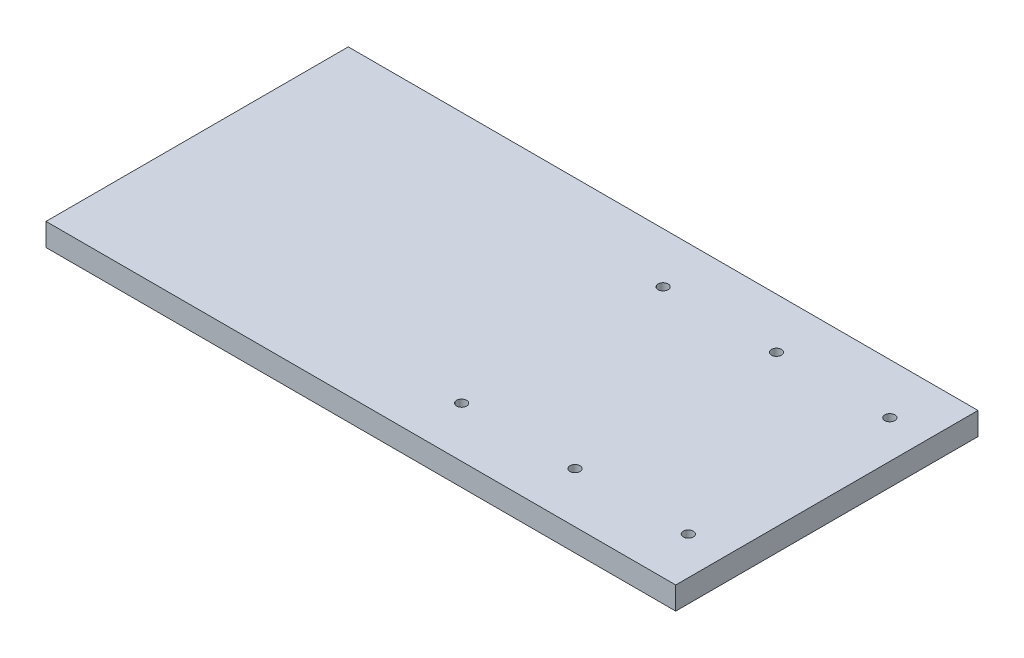
ISO-10303-21;
HEADER;
FILE_DESCRIPTION(('STEP AP214'),'2;1');
FILE_NAME('part.step','',(''),(''),'','','');
FILE_SCHEMA(('AUTOMOTIVE_DESIGN { 1 0 10303 214 1 1 1 1 }'));
ENDSEC;
DATA;
#1=APPLICATION_CONTEXT('core data for automotive mechanical design processes');
#2=APPLICATION_PROTOCOL_DEFINITION('international standard','automotive_design',2000,#1);
#3=PRODUCT_CONTEXT('',#1,'mechanical');
#4=PRODUCT('Part','Part','',(#3));
#5=PRODUCT_RELATED_PRODUCT_CATEGORY('part','',(#4));
#6=PRODUCT_DEFINITION_FORMATION('','',#4);
#7=PRODUCT_DEFINITION_CONTEXT('part definition',#1,'design');
#8=PRODUCT_DEFINITION('design','',#6,#7);
#9=PRODUCT_DEFINITION_SHAPE('','',#8);
#10=(LENGTH_UNIT() NAMED_UNIT(*) SI_UNIT(.MILLI.,.METRE.));
#11=(NAMED_UNIT(*) PLANE_ANGLE_UNIT() SI_UNIT($,.RADIAN.));
#12=(NAMED_UNIT(*) SI_UNIT($,.STERADIAN.) SOLID_ANGLE_UNIT());
#13=UNCERTAINTY_MEASURE_WITH_UNIT(LENGTH_MEASURE(1.E-05),#10,'distance_accuracy_value','');
#14=(GEOMETRIC_REPRESENTATION_CONTEXT(3) GLOBAL_UNCERTAINTY_ASSIGNED_CONTEXT((#13)) GLOBAL_UNIT_ASSIGNED_CONTEXT((#10,
#11,#12)) REPRESENTATION_CONTEXT('',''));
#15=CARTESIAN_POINT('',(0.,0.,0.));
#16=DIRECTION('',(0.,0.,1.));
#17=DIRECTION('',(1.,0.,0.));
#18=AXIS2_PLACEMENT_3D('',#15,#16,#17);
#19=CARTESIAN_POINT('',(0.,18.,0.));
#20=DIRECTION('',(0.,-1.,0.));
#21=DIRECTION('',(0.,0.,-1.));
#22=AXIS2_PLACEMENT_3D('',#19,#20,#21);
#23=PLANE('',#22);
#24=DIRECTION('',(0.,0.,1.));
#25=VECTOR('',#24,1.);
#26=CARTESIAN_POINT('',(0.,18.,0.));
#27=LINE('',#26,#25);
#28=CARTESIAN_POINT('',(0.,18.,-240.));
#29=VERTEX_POINT('',#28);
#30=CARTESIAN_POINT('',(0.,18.,0.));
#31=VERTEX_POINT('',#30);
#32=EDGE_CURVE('E87',#29,#31,#27,.T.);
#33=ORIENTED_EDGE('',*,*,#32,.T.);
#34=DIRECTION('',(1.,0.,0.));
#35=VECTOR('',#34,1.);
#36=CARTESIAN_POINT('',(0.,18.,0.));
#37=LINE('',#36,#35);
#38=CARTESIAN_POINT('',(500.,18.,0.));
#39=VERTEX_POINT('',#38);
#40=EDGE_CURVE('E82',#31,#39,#37,.T.);
#41=ORIENTED_EDGE('',*,*,#40,.T.);
#42=DIRECTION('',(0.,0.,-1.));
#43=VECTOR('',#42,1.);
#44=CARTESIAN_POINT('',(500.,18.,0.));
#45=LINE('',#44,#43);
#46=CARTESIAN_POINT('',(500.,18.,-240.));
#47=VERTEX_POINT('',#46);
#48=EDGE_CURVE('E85',#39,#47,#45,.T.);
#49=ORIENTED_EDGE('',*,*,#48,.T.);
#50=DIRECTION('',(-1.,0.,0.));
#51=VECTOR('',#50,1.);
#52=CARTESIAN_POINT('',(0.,18.,-240.));
#53=LINE('',#52,#51);
#54=EDGE_CURVE('E52',#47,#29,#53,.T.);
#55=ORIENTED_EDGE('',*,*,#54,.T.);
#56=EDGE_LOOP('',(#33,#41,#49,#55));
#57=FACE_BOUND('',#56,.T.);
#58=CARTESIAN_POINT('',(470.,18.,-200.));
#59=DIRECTION('',(0.,1.,0.));
#60=DIRECTION('',(0.,0.,1.));
#61=AXIS2_PLACEMENT_3D('',#58,#59,#60);
#62=CIRCLE('',#61,3.99999999999999);
#63=CARTESIAN_POINT('',(470.,18.,-196.));
#64=VERTEX_POINT('',#63);
#65=EDGE_CURVE('E102',#64,#64,#62,.T.);
#66=ORIENTED_EDGE('',*,*,#65,.F.);
#67=EDGE_LOOP('',(#66));
#68=FACE_BOUND('',#67,.T.);
#69=CARTESIAN_POINT('',(380.,18.,-200.));
#70=DIRECTION('',(0.,1.,0.));
#71=DIRECTION('',(0.,0.,1.));
#72=AXIS2_PLACEMENT_3D('',#69,#70,#71);
#73=CIRCLE('',#72,3.99999999999999);
#74=CARTESIAN_POINT('',(380.,18.,-196.));
#75=VERTEX_POINT('',#74);
#76=EDGE_CURVE('E117',#75,#75,#73,.T.);
#77=ORIENTED_EDGE('',*,*,#76,.F.);
#78=EDGE_LOOP('',(#77));
#79=FACE_BOUND('',#78,.T.);
#80=CARTESIAN_POINT('',(290.,18.,-200.));
#81=DIRECTION('',(0.,1.,0.));
#82=DIRECTION('',(0.,0.,1.));
#83=AXIS2_PLACEMENT_3D('',#80,#81,#82);
#84=CIRCLE('',#83,3.99999999999999);
#85=CARTESIAN_POINT('',(290.,18.,-196.));
#86=VERTEX_POINT('',#85);
#87=EDGE_CURVE('E123',#86,#86,#84,.T.);
#88=ORIENTED_EDGE('',*,*,#87,.F.);
#89=EDGE_LOOP('',(#88));
#90=FACE_BOUND('',#89,.T.);
#91=CARTESIAN_POINT('',(470.,18.,-40.));
#92=DIRECTION('',(0.,1.,0.));
#93=DIRECTION('',(0.,0.,1.));
#94=AXIS2_PLACEMENT_3D('',#91,#92,#93);
#95=CIRCLE('',#94,3.99999999999999);
#96=CARTESIAN_POINT('',(470.,18.,-36.));
#97=VERTEX_POINT('',#96);
#98=EDGE_CURVE('E129',#97,#97,#95,.T.);
#99=ORIENTED_EDGE('',*,*,#98,.F.);
#100=EDGE_LOOP('',(#99));
#101=FACE_BOUND('',#100,.T.);
#102=CARTESIAN_POINT('',(380.,18.,-40.));
#103=DIRECTION('',(0.,1.,0.));
#104=DIRECTION('',(0.,0.,1.));
#105=AXIS2_PLACEMENT_3D('',#102,#103,#104);
#106=CIRCLE('',#105,3.99999999999999);
#107=CARTESIAN_POINT('',(380.,18.,-36.));
#108=VERTEX_POINT('',#107);
#109=EDGE_CURVE('E135',#108,#108,#106,.T.);
#110=ORIENTED_EDGE('',*,*,#109,.F.);
#111=EDGE_LOOP('',(#110));
#112=FACE_BOUND('',#111,.T.);
#113=CARTESIAN_POINT('',(290.,18.,-40.));
#114=DIRECTION('',(0.,1.,0.));
#115=DIRECTION('',(0.,0.,1.));
#116=AXIS2_PLACEMENT_3D('',#113,#114,#115);
#117=CIRCLE('',#116,3.99999999999999);
#118=CARTESIAN_POINT('',(290.,18.,-36.));
#119=VERTEX_POINT('',#118);
#120=EDGE_CURVE('E141',#119,#119,#117,.T.);
#121=ORIENTED_EDGE('',*,*,#120,.F.);
#122=EDGE_LOOP('',(#121));
#123=FACE_BOUND('',#122,.T.);
#124=ADVANCED_FACE('F35',(#57,#68,#79,#90,#101,#112,#123),#23,.F.);
#125=CARTESIAN_POINT('',(0.,0.,0.));
#126=DIRECTION('',(0.,-1.,0.));
#127=DIRECTION('',(0.,0.,-1.));
#128=AXIS2_PLACEMENT_3D('',#125,#126,#127);
#129=PLANE('',#128);
#130=CARTESIAN_POINT('',(380.,0.,-40.));
#131=DIRECTION('',(0.,1.,0.));
#132=DIRECTION('',(0.,0.,1.));
#133=AXIS2_PLACEMENT_3D('',#130,#131,#132);
#134=CIRCLE('',#133,3.99999999999999);
#135=CARTESIAN_POINT('',(380.,0.,-36.));
#136=VERTEX_POINT('',#135);
#137=EDGE_CURVE('E138',#136,#136,#134,.T.);
#138=ORIENTED_EDGE('',*,*,#137,.T.);
#139=EDGE_LOOP('',(#138));
#140=FACE_BOUND('',#139,.T.);
#141=CARTESIAN_POINT('',(290.,0.,-200.));
#142=DIRECTION('',(0.,1.,0.));
#143=DIRECTION('',(0.,0.,1.));
#144=AXIS2_PLACEMENT_3D('',#141,#142,#143);
#145=CIRCLE('',#144,3.99999999999999);
#146=CARTESIAN_POINT('',(290.,0.,-196.));
#147=VERTEX_POINT('',#146);
#148=EDGE_CURVE('E126',#147,#147,#145,.T.);
#149=ORIENTED_EDGE('',*,*,#148,.T.);
#150=EDGE_LOOP('',(#149));
#151=FACE_BOUND('',#150,.T.);
#152=CARTESIAN_POINT('',(470.,0.,-200.));
#153=DIRECTION('',(0.,1.,0.));
#154=DIRECTION('',(0.,0.,1.));
#155=AXIS2_PLACEMENT_3D('',#152,#153,#154);
#156=CIRCLE('',#155,3.99999999999999);
#157=CARTESIAN_POINT('',(470.,0.,-196.));
#158=VERTEX_POINT('',#157);
#159=EDGE_CURVE('E114',#158,#158,#156,.T.);
#160=ORIENTED_EDGE('',*,*,#159,.T.);
#161=EDGE_LOOP('',(#160));
#162=FACE_BOUND('',#161,.T.);
#163=DIRECTION('',(0.,0.,1.));
#164=VECTOR('',#163,1.);
#165=CARTESIAN_POINT('',(0.,0.,0.));
#166=LINE('',#165,#164);
#167=CARTESIAN_POINT('',(0.,0.,-240.));
#168=VERTEX_POINT('',#167);
#169=CARTESIAN_POINT('',(0.,0.,0.));
#170=VERTEX_POINT('',#169);
#171=EDGE_CURVE('E99',#168,#170,#166,.T.);
#172=ORIENTED_EDGE('',*,*,#171,.F.);
#173=DIRECTION('',(-1.,0.,0.));
#174=VECTOR('',#173,1.);
#175=CARTESIAN_POINT('',(0.,0.,-240.));
#176=LINE('',#175,#174);
#177=CARTESIAN_POINT('',(500.,0.,-240.));
#178=VERTEX_POINT('',#177);
#179=EDGE_CURVE('E75',#178,#168,#176,.T.);
#180=ORIENTED_EDGE('',*,*,#179,.F.);
#181=DIRECTION('',(0.,0.,-1.));
#182=VECTOR('',#181,1.);
#183=CARTESIAN_POINT('',(500.,0.,0.));
#184=LINE('',#183,#182);
#185=CARTESIAN_POINT('',(500.,0.,0.));
#186=VERTEX_POINT('',#185);
#187=EDGE_CURVE('E69',#186,#178,#184,.T.);
#188=ORIENTED_EDGE('',*,*,#187,.F.);
#189=DIRECTION('',(1.,0.,0.));
#190=VECTOR('',#189,1.);
#191=CARTESIAN_POINT('',(0.,0.,0.));
#192=LINE('',#191,#190);
#193=EDGE_CURVE('E91',#170,#186,#192,.T.);
#194=ORIENTED_EDGE('',*,*,#193,.F.);
#195=EDGE_LOOP('',(#172,#180,#188,#194));
#196=FACE_BOUND('',#195,.T.);
#197=CARTESIAN_POINT('',(380.,0.,-200.));
#198=DIRECTION('',(0.,1.,0.));
#199=DIRECTION('',(0.,0.,1.));
#200=AXIS2_PLACEMENT_3D('',#197,#198,#199);
#201=CIRCLE('',#200,3.99999999999999);
#202=CARTESIAN_POINT('',(380.,0.,-196.));
#203=VERTEX_POINT('',#202);
#204=EDGE_CURVE('E120',#203,#203,#201,.T.);
#205=ORIENTED_EDGE('',*,*,#204,.T.);
#206=EDGE_LOOP('',(#205));
#207=FACE_BOUND('',#206,.T.);
#208=CARTESIAN_POINT('',(470.,0.,-40.));
#209=DIRECTION('',(0.,1.,0.));
#210=DIRECTION('',(0.,0.,1.));
#211=AXIS2_PLACEMENT_3D('',#208,#209,#210);
#212=CIRCLE('',#211,3.99999999999999);
#213=CARTESIAN_POINT('',(470.,0.,-36.));
#214=VERTEX_POINT('',#213);
#215=EDGE_CURVE('E132',#214,#214,#212,.T.);
#216=ORIENTED_EDGE('',*,*,#215,.T.);
#217=EDGE_LOOP('',(#216));
#218=FACE_BOUND('',#217,.T.);
#219=CARTESIAN_POINT('',(290.,0.,-40.));
#220=DIRECTION('',(0.,1.,0.));
#221=DIRECTION('',(0.,0.,1.));
#222=AXIS2_PLACEMENT_3D('',#219,#220,#221);
#223=CIRCLE('',#222,3.99999999999999);
#224=CARTESIAN_POINT('',(290.,0.,-36.));
#225=VERTEX_POINT('',#224);
#226=EDGE_CURVE('E144',#225,#225,#223,.T.);
#227=ORIENTED_EDGE('',*,*,#226,.T.);
#228=EDGE_LOOP('',(#227));
#229=FACE_BOUND('',#228,.T.);
#230=ADVANCED_FACE('F110',(#140,#151,#162,#196,#207,#218,#229),#129,.T.);
#231=CARTESIAN_POINT('',(0.,18.,0.));
#232=DIRECTION('',(1.,0.,0.));
#233=DIRECTION('',(0.,0.,-1.));
#234=AXIS2_PLACEMENT_3D('',#231,#232,#233);
#235=PLANE('',#234);
#236=ORIENTED_EDGE('',*,*,#171,.T.);
#237=DIRECTION('',(0.,-1.,0.));
#238=VECTOR('',#237,1.);
#239=CARTESIAN_POINT('',(0.,18.,0.));
#240=LINE('',#239,#238);
#241=EDGE_CURVE('E11',#31,#170,#240,.T.);
#242=ORIENTED_EDGE('',*,*,#241,.F.);
#243=ORIENTED_EDGE('',*,*,#32,.F.);
#244=DIRECTION('',(0.,-1.,0.));
#245=VECTOR('',#244,1.);
#246=CARTESIAN_POINT('',(0.,18.,-240.));
#247=LINE('',#246,#245);
#248=EDGE_CURVE('E95',#29,#168,#247,.T.);
#249=ORIENTED_EDGE('',*,*,#248,.T.);
#250=EDGE_LOOP('',(#236,#242,#243,#249));
#251=FACE_BOUND('',#250,.T.);
#252=ADVANCED_FACE('F37',(#251),#235,.F.);
#253=CARTESIAN_POINT('',(0.,18.,0.));
#254=DIRECTION('',(0.,0.,-1.));
#255=DIRECTION('',(-1.,0.,0.));
#256=AXIS2_PLACEMENT_3D('',#253,#254,#255);
#257=PLANE('',#256);
#258=ORIENTED_EDGE('',*,*,#193,.T.);
#259=DIRECTION('',(0.,-1.,0.));
#260=VECTOR('',#259,1.);
#261=CARTESIAN_POINT('',(500.,18.,0.));
#262=LINE('',#261,#260);
#263=EDGE_CURVE('E44',#39,#186,#262,.T.);
#264=ORIENTED_EDGE('',*,*,#263,.F.);
#265=ORIENTED_EDGE('',*,*,#40,.F.);
#266=ORIENTED_EDGE('',*,*,#241,.T.);
#267=EDGE_LOOP('',(#258,#264,#265,#266));
#268=FACE_BOUND('',#267,.T.);
#269=ADVANCED_FACE('F90',(#268),#257,.F.);
#270=CARTESIAN_POINT('',(500.,18.,0.));
#271=DIRECTION('',(-1.,0.,0.));
#272=DIRECTION('',(0.,0.,1.));
#273=AXIS2_PLACEMENT_3D('',#270,#271,#272);
#274=PLANE('',#273);
#275=ORIENTED_EDGE('',*,*,#187,.T.);
#276=DIRECTION('',(0.,-1.,0.));
#277=VECTOR('',#276,1.);
#278=CARTESIAN_POINT('',(500.,18.,-240.));
#279=LINE('',#278,#277);
#280=EDGE_CURVE('E92',#47,#178,#279,.T.);
#281=ORIENTED_EDGE('',*,*,#280,.F.);
#282=ORIENTED_EDGE('',*,*,#48,.F.);
#283=ORIENTED_EDGE('',*,*,#263,.T.);
#284=EDGE_LOOP('',(#275,#281,#282,#283));
#285=FACE_BOUND('',#284,.T.);
#286=ADVANCED_FACE('F93',(#285),#274,.F.);
#287=CARTESIAN_POINT('',(0.,18.,-240.));
#288=DIRECTION('',(0.,0.,1.));
#289=DIRECTION('',(1.,0.,0.));
#290=AXIS2_PLACEMENT_3D('',#287,#288,#289);
#291=PLANE('',#290);
#292=ORIENTED_EDGE('',*,*,#179,.T.);
#293=ORIENTED_EDGE('',*,*,#248,.F.);
#294=ORIENTED_EDGE('',*,*,#54,.F.);
#295=ORIENTED_EDGE('',*,*,#280,.T.);
#296=EDGE_LOOP('',(#292,#293,#294,#295));
#297=FACE_BOUND('',#296,.T.);
#298=ADVANCED_FACE('F107',(#297),#291,.F.);
#299=CARTESIAN_POINT('',(470.,18.,-200.));
#300=DIRECTION('',(0.,-1.,0.));
#301=DIRECTION('',(0.,0.,-1.));
#302=AXIS2_PLACEMENT_3D('',#299,#300,#301);
#303=CYLINDRICAL_SURFACE('',#302,3.99999999999999);
#304=ORIENTED_EDGE('',*,*,#65,.T.);
#305=EDGE_LOOP('',(#304));
#306=FACE_BOUND('',#305,.T.);
#307=ORIENTED_EDGE('',*,*,#159,.F.);
#308=EDGE_LOOP('',(#307));
#309=FACE_BOUND('',#308,.T.);
#310=ADVANCED_FACE('F161',(#306,#309),#303,.F.);
#311=CARTESIAN_POINT('',(380.,18.,-200.));
#312=DIRECTION('',(0.,-1.,0.));
#313=DIRECTION('',(0.,0.,-1.));
#314=AXIS2_PLACEMENT_3D('',#311,#312,#313);
#315=CYLINDRICAL_SURFACE('',#314,3.99999999999999);
#316=ORIENTED_EDGE('',*,*,#76,.T.);
#317=EDGE_LOOP('',(#316));
#318=FACE_BOUND('',#317,.T.);
#319=ORIENTED_EDGE('',*,*,#204,.F.);
#320=EDGE_LOOP('',(#319));
#321=FACE_BOUND('',#320,.T.);
#322=ADVANCED_FACE('F207',(#318,#321),#315,.F.);
#323=CARTESIAN_POINT('',(290.,18.,-200.));
#324=DIRECTION('',(0.,-1.,0.));
#325=DIRECTION('',(0.,0.,-1.));
#326=AXIS2_PLACEMENT_3D('',#323,#324,#325);
#327=CYLINDRICAL_SURFACE('',#326,3.99999999999999);
#328=ORIENTED_EDGE('',*,*,#87,.T.);
#329=EDGE_LOOP('',(#328));
#330=FACE_BOUND('',#329,.T.);
#331=ORIENTED_EDGE('',*,*,#148,.F.);
#332=EDGE_LOOP('',(#331));
#333=FACE_BOUND('',#332,.T.);
#334=ADVANCED_FACE('F215',(#330,#333),#327,.F.);
#335=CARTESIAN_POINT('',(470.,18.,-40.));
#336=DIRECTION('',(0.,-1.,0.));
#337=DIRECTION('',(0.,0.,-1.));
#338=AXIS2_PLACEMENT_3D('',#335,#336,#337);
#339=CYLINDRICAL_SURFACE('',#338,3.99999999999999);
#340=ORIENTED_EDGE('',*,*,#98,.T.);
#341=EDGE_LOOP('',(#340));
#342=FACE_BOUND('',#341,.T.);
#343=ORIENTED_EDGE('',*,*,#215,.F.);
#344=EDGE_LOOP('',(#343));
#345=FACE_BOUND('',#344,.T.);
#346=ADVANCED_FACE('F223',(#342,#345),#339,.F.);
#347=CARTESIAN_POINT('',(380.,18.,-40.));
#348=DIRECTION('',(0.,-1.,0.));
#349=DIRECTION('',(0.,0.,-1.));
#350=AXIS2_PLACEMENT_3D('',#347,#348,#349);
#351=CYLINDRICAL_SURFACE('',#350,3.99999999999999);
#352=ORIENTED_EDGE('',*,*,#109,.T.);
#353=EDGE_LOOP('',(#352));
#354=FACE_BOUND('',#353,.T.);
#355=ORIENTED_EDGE('',*,*,#137,.F.);
#356=EDGE_LOOP('',(#355));
#357=FACE_BOUND('',#356,.T.);
#358=ADVANCED_FACE('F232',(#354,#357),#351,.F.);
#359=CARTESIAN_POINT('',(290.,18.,-40.));
#360=DIRECTION('',(0.,-1.,0.));
#361=DIRECTION('',(0.,0.,-1.));
#362=AXIS2_PLACEMENT_3D('',#359,#360,#361);
#363=CYLINDRICAL_SURFACE('',#362,3.99999999999999);
#364=ORIENTED_EDGE('',*,*,#120,.T.);
#365=EDGE_LOOP('',(#364));
#366=FACE_BOUND('',#365,.T.);
#367=ORIENTED_EDGE('',*,*,#226,.F.);
#368=EDGE_LOOP('',(#367));
#369=FACE_BOUND('',#368,.T.);
#370=ADVANCED_FACE('F150',(#366,#369),#363,.F.);
#371=CLOSED_SHELL('',(#124,#230,#252,#269,#286,#298,#310,#322,#334,#346,#358,#370));
#372=MANIFOLD_SOLID_BREP('B2',#371);
#373=ADVANCED_BREP_SHAPE_REPRESENTATION('',(#18,#372),#14);
#374=SHAPE_DEFINITION_REPRESENTATION(#9,#373);
ENDSEC;
END-ISO-10303-21;
